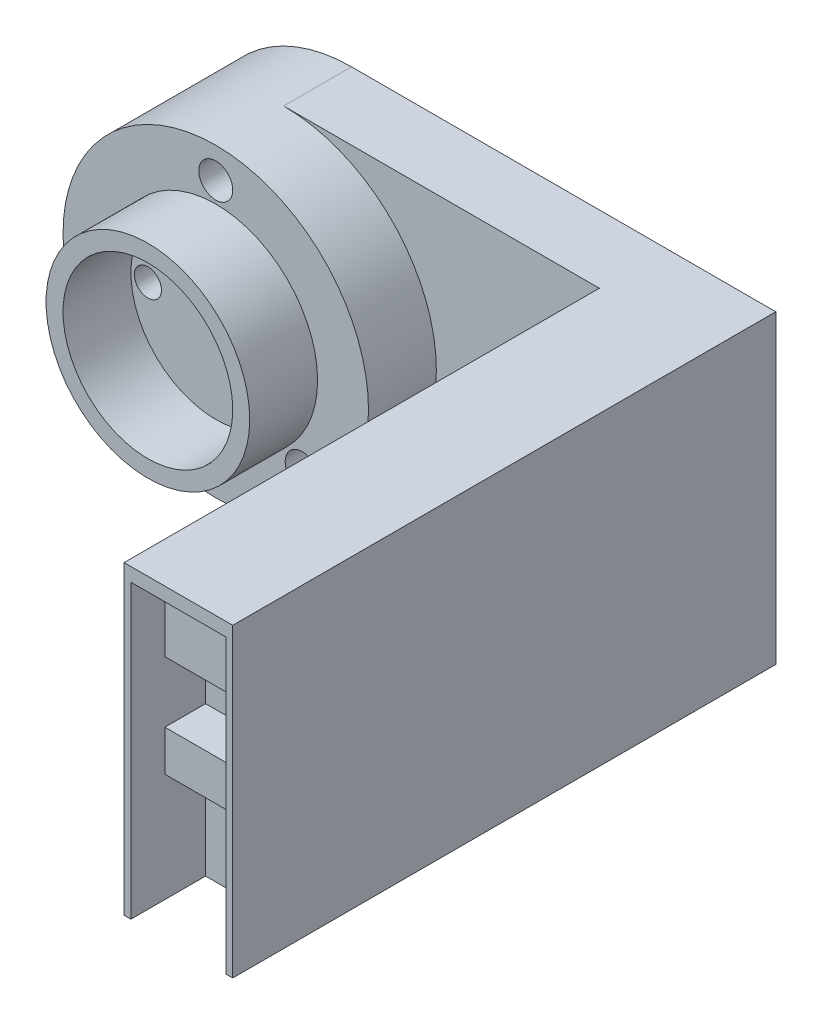
ISO-10303-21;
HEADER;
FILE_DESCRIPTION(('STEP AP214'),'2;1');
FILE_NAME('part.step','',(''),(''),'','','');
FILE_SCHEMA(('AUTOMOTIVE_DESIGN { 1 0 10303 214 1 1 1 1 }'));
ENDSEC;
DATA;
#1=APPLICATION_CONTEXT('core data for automotive mechanical design processes');
#2=APPLICATION_PROTOCOL_DEFINITION('international standard','automotive_design',2000,#1);
#3=PRODUCT_CONTEXT('',#1,'mechanical');
#4=PRODUCT('Part','Part','',(#3));
#5=PRODUCT_RELATED_PRODUCT_CATEGORY('part','',(#4));
#6=PRODUCT_DEFINITION_FORMATION('','',#4);
#7=PRODUCT_DEFINITION_CONTEXT('part definition',#1,'design');
#8=PRODUCT_DEFINITION('design','',#6,#7);
#9=PRODUCT_DEFINITION_SHAPE('','',#8);
#10=(LENGTH_UNIT() NAMED_UNIT(*) SI_UNIT(.MILLI.,.METRE.));
#11=(NAMED_UNIT(*) PLANE_ANGLE_UNIT() SI_UNIT($,.RADIAN.));
#12=(NAMED_UNIT(*) SI_UNIT($,.STERADIAN.) SOLID_ANGLE_UNIT());
#13=UNCERTAINTY_MEASURE_WITH_UNIT(LENGTH_MEASURE(1.E-05),#10,'distance_accuracy_value','');
#14=(GEOMETRIC_REPRESENTATION_CONTEXT(3) GLOBAL_UNCERTAINTY_ASSIGNED_CONTEXT((#13)) GLOBAL_UNIT_ASSIGNED_CONTEXT((#10,
#11,#12)) REPRESENTATION_CONTEXT('',''));
#15=CARTESIAN_POINT('',(0.,0.,0.));
#16=DIRECTION('',(0.,0.,1.));
#17=DIRECTION('',(1.,0.,0.));
#18=AXIS2_PLACEMENT_3D('',#15,#16,#17);
#19=CARTESIAN_POINT('',(0.,0.,10.));
#20=DIRECTION('',(0.,0.,1.));
#21=DIRECTION('',(1.,0.,0.));
#22=AXIS2_PLACEMENT_3D('',#19,#20,#21);
#23=PLANE('',#22);
#24=DIRECTION('',(1.,0.,0.));
#25=VECTOR('',#24,1.);
#26=CARTESIAN_POINT('',(0.,-22.5,10.));
#27=LINE('',#26,#25);
#28=CARTESIAN_POINT('',(0.,-22.5,10.));
#29=VERTEX_POINT('',#28);
#30=CARTESIAN_POINT('',(46.5,-22.5,10.));
#31=VERTEX_POINT('',#30);
#32=EDGE_CURVE('E432',#29,#31,#27,.T.);
#33=ORIENTED_EDGE('',*,*,#32,.T.);
#34=DIRECTION('',(0.,-1.,0.));
#35=VECTOR('',#34,1.);
#36=CARTESIAN_POINT('',(46.5,22.5,10.));
#37=LINE('',#36,#35);
#38=CARTESIAN_POINT('',(46.5,22.5,10.));
#39=VERTEX_POINT('',#38);
#40=EDGE_CURVE('E342',#39,#31,#37,.T.);
#41=ORIENTED_EDGE('',*,*,#40,.F.);
#42=DIRECTION('',(-1.,0.,0.));
#43=VECTOR('',#42,1.);
#44=CARTESIAN_POINT('',(0.,22.5,10.));
#45=LINE('',#44,#43);
#46=CARTESIAN_POINT('',(0.,22.5,10.));
#47=VERTEX_POINT('',#46);
#48=EDGE_CURVE('E435',#39,#47,#45,.T.);
#49=ORIENTED_EDGE('',*,*,#48,.T.);
#50=CARTESIAN_POINT('',(0.,0.,10.));
#51=DIRECTION('',(0.,0.,1.));
#52=DIRECTION('',(1.,0.,0.));
#53=AXIS2_PLACEMENT_3D('',#50,#51,#52);
#54=CIRCLE('',#53,22.5);
#55=EDGE_CURVE('E431',#29,#47,#54,.T.);
#56=ORIENTED_EDGE('',*,*,#55,.F.);
#57=EDGE_LOOP('',(#33,#41,#49,#56));
#58=FACE_BOUND('',#57,.T.);
#59=ADVANCED_FACE('F45',(#58),#23,.T.);
#60=CARTESIAN_POINT('',(0.,0.,20.));
#61=DIRECTION('',(0.,0.,-1.));
#62=DIRECTION('',(-1.,0.,0.));
#63=AXIS2_PLACEMENT_3D('',#60,#61,#62);
#64=CYLINDRICAL_SURFACE('',#63,22.5);
#65=CARTESIAN_POINT('',(0.,0.,0.));
#66=DIRECTION('',(0.,0.,1.));
#67=DIRECTION('',(1.,0.,0.));
#68=AXIS2_PLACEMENT_3D('',#65,#66,#67);
#69=CIRCLE('',#68,22.5);
#70=CARTESIAN_POINT('',(0.,22.5,0.));
#71=VERTEX_POINT('',#70);
#72=CARTESIAN_POINT('',(-22.1415898254845,4.,0.));
#73=VERTEX_POINT('',#72);
#74=EDGE_CURVE('E468',#71,#73,#69,.T.);
#75=ORIENTED_EDGE('',*,*,#74,.T.);
#76=DIRECTION('',(0.,0.,-1.));
#77=VECTOR('',#76,1.);
#78=CARTESIAN_POINT('',(-22.1415898254845,4.,20.));
#79=LINE('',#78,#77);
#80=CARTESIAN_POINT('',(-22.1415898254845,4.,10.));
#81=VERTEX_POINT('',#80);
#82=EDGE_CURVE('E247',#73,#81,#79,.F.);
#83=ORIENTED_EDGE('',*,*,#82,.T.);
#84=CARTESIAN_POINT('',(0.,0.,10.));
#85=DIRECTION('',(0.,0.,1.));
#86=DIRECTION('',(1.,0.,0.));
#87=AXIS2_PLACEMENT_3D('',#84,#85,#86);
#88=CIRCLE('',#87,22.5);
#89=CARTESIAN_POINT('',(-22.1415898254845,-4.,10.));
#90=VERTEX_POINT('',#89);
#91=EDGE_CURVE('E242',#81,#90,#88,.T.);
#92=ORIENTED_EDGE('',*,*,#91,.T.);
#93=DIRECTION('',(0.,0.,-1.));
#94=VECTOR('',#93,1.);
#95=CARTESIAN_POINT('',(-22.1415898254845,-4.,20.));
#96=LINE('',#95,#94);
#97=CARTESIAN_POINT('',(-22.1415898254845,-4.,0.));
#98=VERTEX_POINT('',#97);
#99=EDGE_CURVE('E221',#90,#98,#96,.T.);
#100=ORIENTED_EDGE('',*,*,#99,.T.);
#101=CARTESIAN_POINT('',(0.,-22.5,0.));
#102=VERTEX_POINT('',#101);
#103=EDGE_CURVE('E463',#98,#102,#69,.T.);
#104=ORIENTED_EDGE('',*,*,#103,.T.);
#105=DIRECTION('',(0.,0.,-1.));
#106=VECTOR('',#105,1.);
#107=CARTESIAN_POINT('',(0.,-22.5,10.));
#108=LINE('',#107,#106);
#109=EDGE_CURVE('E459',#29,#102,#108,.T.);
#110=ORIENTED_EDGE('',*,*,#109,.F.);
#111=ORIENTED_EDGE('',*,*,#55,.T.);
#112=DIRECTION('',(0.,0.,-1.));
#113=VECTOR('',#112,1.);
#114=CARTESIAN_POINT('',(0.,22.5,10.));
#115=LINE('',#114,#113);
#116=EDGE_CURVE('E439',#47,#71,#115,.T.);
#117=ORIENTED_EDGE('',*,*,#116,.T.);
#118=EDGE_LOOP('',(#75,#83,#92,#100,#104,#110,#111,#117));
#119=FACE_BOUND('',#118,.T.);
#120=CARTESIAN_POINT('',(0.,0.,20.));
#121=DIRECTION('',(0.,0.,1.));
#122=DIRECTION('',(1.,0.,0.));
#123=AXIS2_PLACEMENT_3D('',#120,#121,#122);
#124=CIRCLE('',#123,22.5);
#125=CARTESIAN_POINT('',(22.5,0.,20.));
#126=VERTEX_POINT('',#125);
#127=EDGE_CURVE('E464',#126,#126,#124,.T.);
#128=ORIENTED_EDGE('',*,*,#127,.F.);
#129=EDGE_LOOP('',(#128));
#130=FACE_BOUND('',#129,.T.);
#131=ADVANCED_FACE('F47',(#119,#130),#64,.T.);
#132=CARTESIAN_POINT('',(0.,0.,20.));
#133=DIRECTION('',(0.,0.,1.));
#134=DIRECTION('',(1.,0.,0.));
#135=AXIS2_PLACEMENT_3D('',#132,#133,#134);
#136=PLANE('',#135);
#137=CARTESIAN_POINT('',(0.,18.,20.));
#138=DIRECTION('',(0.,0.,1.));
#139=DIRECTION('',(1.,0.,0.));
#140=AXIS2_PLACEMENT_3D('',#137,#138,#139);
#141=CIRCLE('',#140,2.5);
#142=CARTESIAN_POINT('',(2.5,18.,20.));
#143=VERTEX_POINT('',#142);
#144=EDGE_CURVE('E384',#143,#143,#141,.T.);
#145=ORIENTED_EDGE('',*,*,#144,.F.);
#146=EDGE_LOOP('',(#145));
#147=FACE_BOUND('',#146,.T.);
#148=CARTESIAN_POINT('',(12.7279220613579,-12.7279220613579,20.));
#149=DIRECTION('',(0.,0.,1.));
#150=DIRECTION('',(1.,0.,0.));
#151=AXIS2_PLACEMENT_3D('',#148,#149,#150);
#152=CIRCLE('',#151,2.5);
#153=CARTESIAN_POINT('',(15.2279220613578,-12.7279220613579,20.));
#154=VERTEX_POINT('',#153);
#155=EDGE_CURVE('E388',#154,#154,#152,.T.);
#156=ORIENTED_EDGE('',*,*,#155,.F.);
#157=EDGE_LOOP('',(#156));
#158=FACE_BOUND('',#157,.T.);
#159=CARTESIAN_POINT('',(-12.7279220613579,-12.7279220613579,20.));
#160=DIRECTION('',(0.,0.,1.));
#161=DIRECTION('',(1.,0.,0.));
#162=AXIS2_PLACEMENT_3D('',#159,#160,#161);
#163=CIRCLE('',#162,2.5);
#164=CARTESIAN_POINT('',(-10.2279220613579,-12.7279220613579,20.));
#165=VERTEX_POINT('',#164);
#166=EDGE_CURVE('E396',#165,#165,#163,.T.);
#167=ORIENTED_EDGE('',*,*,#166,.F.);
#168=EDGE_LOOP('',(#167));
#169=FACE_BOUND('',#168,.T.);
#170=CARTESIAN_POINT('',(0.,0.,20.));
#171=DIRECTION('',(0.,0.,1.));
#172=DIRECTION('',(1.,0.,0.));
#173=AXIS2_PLACEMENT_3D('',#170,#171,#172);
#174=CIRCLE('',#173,15.);
#175=CARTESIAN_POINT('',(15.,0.,20.));
#176=VERTEX_POINT('',#175);
#177=EDGE_CURVE('E427',#176,#176,#174,.T.);
#178=ORIENTED_EDGE('',*,*,#177,.F.);
#179=EDGE_LOOP('',(#178));
#180=FACE_BOUND('',#179,.T.);
#181=ORIENTED_EDGE('',*,*,#127,.T.);
#182=EDGE_LOOP('',(#181));
#183=FACE_BOUND('',#182,.T.);
#184=ADVANCED_FACE('F578',(#147,#158,#169,#180,#183),#136,.T.);
#185=CARTESIAN_POINT('',(0.,0.,0.));
#186=DIRECTION('',(0.,0.,1.));
#187=DIRECTION('',(1.,0.,0.));
#188=AXIS2_PLACEMENT_3D('',#185,#186,#187);
#189=PLANE('',#188);
#190=CARTESIAN_POINT('',(10.,0.,0.));
#191=DIRECTION('',(0.,0.,1.));
#192=DIRECTION('',(-1.,0.,0.));
#193=AXIS2_PLACEMENT_3D('',#190,#191,#192);
#194=CIRCLE('',#193,2.);
#195=CARTESIAN_POINT('',(10.,-2.,0.));
#196=VERTEX_POINT('',#195);
#197=CARTESIAN_POINT('',(10.,2.,0.));
#198=VERTEX_POINT('',#197);
#199=EDGE_CURVE('E383',#196,#198,#194,.T.);
#200=ORIENTED_EDGE('',*,*,#199,.T.);
#201=DIRECTION('',(0.,-1.,0.));
#202=VECTOR('',#201,1.);
#203=CARTESIAN_POINT('',(10.,2.,0.));
#204=LINE('',#203,#202);
#205=CARTESIAN_POINT('',(10.,4.,0.));
#206=VERTEX_POINT('',#205);
#207=EDGE_CURVE('E206',#206,#198,#204,.T.);
#208=ORIENTED_EDGE('',*,*,#207,.F.);
#209=DIRECTION('',(1.,0.,0.));
#210=VECTOR('',#209,1.);
#211=CARTESIAN_POINT('',(10.,4.,0.));
#212=LINE('',#211,#210);
#213=EDGE_CURVE('E231',#73,#206,#212,.T.);
#214=ORIENTED_EDGE('',*,*,#213,.F.);
#215=ORIENTED_EDGE('',*,*,#74,.F.);
#216=DIRECTION('',(-1.,0.,0.));
#217=VECTOR('',#216,1.);
#218=CARTESIAN_POINT('',(0.,22.5,0.));
#219=LINE('',#218,#217);
#220=CARTESIAN_POINT('',(62.5,22.5,0.));
#221=VERTEX_POINT('',#220);
#222=EDGE_CURVE('E436',#221,#71,#219,.T.);
#223=ORIENTED_EDGE('',*,*,#222,.F.);
#224=DIRECTION('',(0.,1.,0.));
#225=VECTOR('',#224,1.);
#226=CARTESIAN_POINT('',(62.5,22.5,0.));
#227=LINE('',#226,#225);
#228=CARTESIAN_POINT('',(62.5,-22.5,0.));
#229=VERTEX_POINT('',#228);
#230=EDGE_CURVE('E442',#229,#221,#227,.T.);
#231=ORIENTED_EDGE('',*,*,#230,.F.);
#232=DIRECTION('',(1.,0.,0.));
#233=VECTOR('',#232,1.);
#234=CARTESIAN_POINT('',(0.,-22.5,0.));
#235=LINE('',#234,#233);
#236=EDGE_CURVE('E426',#102,#229,#235,.T.);
#237=ORIENTED_EDGE('',*,*,#236,.F.);
#238=ORIENTED_EDGE('',*,*,#103,.F.);
#239=DIRECTION('',(-1.,0.,0.));
#240=VECTOR('',#239,1.);
#241=CARTESIAN_POINT('',(-24.,-4.,0.));
#242=LINE('',#241,#240);
#243=CARTESIAN_POINT('',(10.,-4.,0.));
#244=VERTEX_POINT('',#243);
#245=EDGE_CURVE('E228',#244,#98,#242,.T.);
#246=ORIENTED_EDGE('',*,*,#245,.F.);
#247=EDGE_CURVE('E212',#196,#244,#204,.T.);
#248=ORIENTED_EDGE('',*,*,#247,.F.);
#249=EDGE_LOOP('',(#200,#208,#214,#215,#223,#231,#237,#238,#246,#248));
#250=FACE_BOUND('',#249,.T.);
#251=ADVANCED_FACE('F483',(#250),#189,.F.);
#252=CARTESIAN_POINT('',(0.,-22.5,10.));
#253=DIRECTION('',(0.,1.,0.));
#254=DIRECTION('',(0.,0.,1.));
#255=AXIS2_PLACEMENT_3D('',#252,#253,#254);
#256=PLANE('',#255);
#257=DIRECTION('',(1.,0.,0.));
#258=VECTOR('',#257,1.);
#259=CARTESIAN_POINT('',(47.5,-22.5,69.));
#260=LINE('',#259,#258);
#261=CARTESIAN_POINT('',(47.5,-22.5,69.));
#262=VERTEX_POINT('',#261);
#263=CARTESIAN_POINT('',(61.5,-22.5,69.));
#264=VERTEX_POINT('',#263);
#265=EDGE_CURVE('E309',#262,#264,#260,.T.);
#266=ORIENTED_EDGE('',*,*,#265,.F.);
#267=DIRECTION('',(0.,0.,1.));
#268=VECTOR('',#267,1.);
#269=CARTESIAN_POINT('',(47.5,-22.5,75.));
#270=LINE('',#269,#268);
#271=CARTESIAN_POINT('',(47.5,-22.5,80.));
#272=VERTEX_POINT('',#271);
#273=EDGE_CURVE('E328',#262,#272,#270,.T.);
#274=ORIENTED_EDGE('',*,*,#273,.T.);
#275=DIRECTION('',(1.,0.,0.));
#276=VECTOR('',#275,1.);
#277=CARTESIAN_POINT('',(62.5,-22.5,80.));
#278=LINE('',#277,#276);
#279=CARTESIAN_POINT('',(46.5,-22.5,80.));
#280=VERTEX_POINT('',#279);
#281=EDGE_CURVE('E363',#280,#272,#278,.T.);
#282=ORIENTED_EDGE('',*,*,#281,.F.);
#283=DIRECTION('',(0.,0.,-1.));
#284=VECTOR('',#283,1.);
#285=CARTESIAN_POINT('',(46.5,-22.5,80.));
#286=LINE('',#285,#284);
#287=EDGE_CURVE('E367',#280,#31,#286,.T.);
#288=ORIENTED_EDGE('',*,*,#287,.T.);
#289=ORIENTED_EDGE('',*,*,#32,.F.);
#290=ORIENTED_EDGE('',*,*,#109,.T.);
#291=ORIENTED_EDGE('',*,*,#236,.T.);
#292=DIRECTION('',(0.,0.,-1.));
#293=VECTOR('',#292,1.);
#294=CARTESIAN_POINT('',(62.5,-22.5,10.));
#295=LINE('',#294,#293);
#296=CARTESIAN_POINT('',(62.5,-22.5,80.));
#297=VERTEX_POINT('',#296);
#298=EDGE_CURVE('E455',#297,#229,#295,.T.);
#299=ORIENTED_EDGE('',*,*,#298,.F.);
#300=CARTESIAN_POINT('',(61.5,-22.5,80.));
#301=VERTEX_POINT('',#300);
#302=EDGE_CURVE('E362',#301,#297,#278,.T.);
#303=ORIENTED_EDGE('',*,*,#302,.F.);
#304=DIRECTION('',(0.,0.,1.));
#305=VECTOR('',#304,1.);
#306=CARTESIAN_POINT('',(61.5,-22.5,75.));
#307=LINE('',#306,#305);
#308=EDGE_CURVE('E346',#264,#301,#307,.T.);
#309=ORIENTED_EDGE('',*,*,#308,.F.);
#310=EDGE_LOOP('',(#266,#274,#282,#288,#289,#290,#291,#299,#303,#309));
#311=FACE_BOUND('',#310,.T.);
#312=ADVANCED_FACE('F512',(#311),#256,.F.);
#313=CARTESIAN_POINT('',(62.5,22.5,10.));
#314=DIRECTION('',(-1.,0.,0.));
#315=DIRECTION('',(0.,0.,1.));
#316=AXIS2_PLACEMENT_3D('',#313,#314,#315);
#317=PLANE('',#316);
#318=ORIENTED_EDGE('',*,*,#230,.T.);
#319=DIRECTION('',(0.,0.,-1.));
#320=VECTOR('',#319,1.);
#321=CARTESIAN_POINT('',(62.5,22.5,10.));
#322=LINE('',#321,#320);
#323=CARTESIAN_POINT('',(62.5,22.5,80.));
#324=VERTEX_POINT('',#323);
#325=EDGE_CURVE('E451',#324,#221,#322,.T.);
#326=ORIENTED_EDGE('',*,*,#325,.F.);
#327=DIRECTION('',(0.,1.,0.));
#328=VECTOR('',#327,1.);
#329=CARTESIAN_POINT('',(62.5,22.5,80.));
#330=LINE('',#329,#328);
#331=EDGE_CURVE('E352',#297,#324,#330,.T.);
#332=ORIENTED_EDGE('',*,*,#331,.F.);
#333=ORIENTED_EDGE('',*,*,#298,.T.);
#334=EDGE_LOOP('',(#318,#326,#332,#333));
#335=FACE_BOUND('',#334,.T.);
#336=ADVANCED_FACE('F506',(#335),#317,.F.);
#337=CARTESIAN_POINT('',(0.,22.5,10.));
#338=DIRECTION('',(0.,-1.,0.));
#339=DIRECTION('',(0.,0.,-1.));
#340=AXIS2_PLACEMENT_3D('',#337,#338,#339);
#341=PLANE('',#340);
#342=ORIENTED_EDGE('',*,*,#222,.T.);
#343=ORIENTED_EDGE('',*,*,#116,.F.);
#344=ORIENTED_EDGE('',*,*,#48,.F.);
#345=DIRECTION('',(0.,0.,-1.));
#346=VECTOR('',#345,1.);
#347=CARTESIAN_POINT('',(46.5,22.5,80.));
#348=LINE('',#347,#346);
#349=CARTESIAN_POINT('',(46.5,22.5,80.));
#350=VERTEX_POINT('',#349);
#351=EDGE_CURVE('E374',#350,#39,#348,.T.);
#352=ORIENTED_EDGE('',*,*,#351,.F.);
#353=DIRECTION('',(-1.,0.,0.));
#354=VECTOR('',#353,1.);
#355=CARTESIAN_POINT('',(62.5,22.5,80.));
#356=LINE('',#355,#354);
#357=EDGE_CURVE('E356',#324,#350,#356,.T.);
#358=ORIENTED_EDGE('',*,*,#357,.F.);
#359=ORIENTED_EDGE('',*,*,#325,.T.);
#360=EDGE_LOOP('',(#342,#343,#344,#352,#358,#359));
#361=FACE_BOUND('',#360,.T.);
#362=ADVANCED_FACE('F502',(#361),#341,.F.);
#363=CARTESIAN_POINT('',(0.,0.,30.));
#364=DIRECTION('',(0.,0.,-1.));
#365=DIRECTION('',(-1.,0.,0.));
#366=AXIS2_PLACEMENT_3D('',#363,#364,#365);
#367=CYLINDRICAL_SURFACE('',#366,15.);
#368=CARTESIAN_POINT('',(0.,0.,30.));
#369=DIRECTION('',(0.,0.,1.));
#370=DIRECTION('',(1.,0.,0.));
#371=AXIS2_PLACEMENT_3D('',#368,#369,#370);
#372=CIRCLE('',#371,15.);
#373=CARTESIAN_POINT('',(15.,0.,30.));
#374=VERTEX_POINT('',#373);
#375=EDGE_CURVE('E419',#374,#374,#372,.T.);
#376=ORIENTED_EDGE('',*,*,#375,.F.);
#377=EDGE_LOOP('',(#376));
#378=FACE_BOUND('',#377,.T.);
#379=ORIENTED_EDGE('',*,*,#177,.T.);
#380=EDGE_LOOP('',(#379));
#381=FACE_BOUND('',#380,.T.);
#382=ADVANCED_FACE('F581',(#378,#381),#367,.T.);
#383=CARTESIAN_POINT('',(0.,0.,30.));
#384=DIRECTION('',(0.,0.,1.));
#385=DIRECTION('',(1.,0.,0.));
#386=AXIS2_PLACEMENT_3D('',#383,#384,#385);
#387=PLANE('',#386);
#388=CARTESIAN_POINT('',(0.,0.,30.));
#389=DIRECTION('',(0.,0.,1.));
#390=DIRECTION('',(1.,0.,0.));
#391=AXIS2_PLACEMENT_3D('',#388,#389,#390);
#392=CIRCLE('',#391,12.5);
#393=CARTESIAN_POINT('',(12.5,0.,30.));
#394=VERTEX_POINT('',#393);
#395=EDGE_CURVE('E407',#394,#394,#392,.T.);
#396=ORIENTED_EDGE('',*,*,#395,.F.);
#397=EDGE_LOOP('',(#396));
#398=FACE_BOUND('',#397,.T.);
#399=ORIENTED_EDGE('',*,*,#375,.T.);
#400=EDGE_LOOP('',(#399));
#401=FACE_BOUND('',#400,.T.);
#402=ADVANCED_FACE('F818',(#398,#401),#387,.T.);
#403=CARTESIAN_POINT('',(0.,0.,20.));
#404=DIRECTION('',(0.,0.,1.));
#405=DIRECTION('',(1.,0.,0.));
#406=AXIS2_PLACEMENT_3D('',#403,#404,#405);
#407=CYLINDRICAL_SURFACE('',#406,12.5);
#408=CARTESIAN_POINT('',(0.,0.,20.));
#409=DIRECTION('',(0.,0.,1.));
#410=DIRECTION('',(1.,0.,0.));
#411=AXIS2_PLACEMENT_3D('',#408,#409,#410);
#412=CIRCLE('',#411,12.5);
#413=CARTESIAN_POINT('',(12.5,0.,20.));
#414=VERTEX_POINT('',#413);
#415=EDGE_CURVE('E415',#414,#414,#412,.T.);
#416=ORIENTED_EDGE('',*,*,#415,.F.);
#417=EDGE_LOOP('',(#416));
#418=FACE_BOUND('',#417,.T.);
#419=ORIENTED_EDGE('',*,*,#395,.T.);
#420=EDGE_LOOP('',(#419));
#421=FACE_BOUND('',#420,.T.);
#422=ADVANCED_FACE('F809',(#418,#421),#407,.F.);
#423=CARTESIAN_POINT('',(0.,0.,20.));
#424=DIRECTION('',(0.,0.,1.));
#425=DIRECTION('',(1.,0.,0.));
#426=AXIS2_PLACEMENT_3D('',#423,#424,#425);
#427=PLANE('',#426);
#428=CARTESIAN_POINT('',(-10.,0.,20.));
#429=DIRECTION('',(0.,0.,1.));
#430=DIRECTION('',(1.,0.,0.));
#431=AXIS2_PLACEMENT_3D('',#428,#429,#430);
#432=CIRCLE('',#431,2.);
#433=CARTESIAN_POINT('',(-8.,0.,20.));
#434=VERTEX_POINT('',#433);
#435=EDGE_CURVE('E403',#434,#434,#432,.T.);
#436=ORIENTED_EDGE('',*,*,#435,.F.);
#437=EDGE_LOOP('',(#436));
#438=FACE_BOUND('',#437,.T.);
#439=CARTESIAN_POINT('',(10.,0.,20.));
#440=DIRECTION('',(0.,0.,1.));
#441=DIRECTION('',(-1.,0.,0.));
#442=AXIS2_PLACEMENT_3D('',#439,#440,#441);
#443=CIRCLE('',#442,2.);
#444=CARTESIAN_POINT('',(8.,0.,20.));
#445=VERTEX_POINT('',#444);
#446=EDGE_CURVE('E408',#445,#445,#443,.T.);
#447=ORIENTED_EDGE('',*,*,#446,.F.);
#448=EDGE_LOOP('',(#447));
#449=FACE_BOUND('',#448,.T.);
#450=ORIENTED_EDGE('',*,*,#415,.T.);
#451=EDGE_LOOP('',(#450));
#452=FACE_BOUND('',#451,.T.);
#453=ADVANCED_FACE('F605',(#438,#449,#452),#427,.T.);
#454=CARTESIAN_POINT('',(10.,0.,0.));
#455=DIRECTION('',(0.,0.,1.));
#456=DIRECTION('',(1.,0.,0.));
#457=AXIS2_PLACEMENT_3D('',#454,#455,#456);
#458=CYLINDRICAL_SURFACE('',#457,2.);
#459=CARTESIAN_POINT('',(10.,0.,10.));
#460=DIRECTION('',(0.,0.,1.));
#461=DIRECTION('',(1.,0.,0.));
#462=AXIS2_PLACEMENT_3D('',#459,#460,#461);
#463=CIRCLE('',#462,2.);
#464=CARTESIAN_POINT('',(10.,-2.,10.));
#465=VERTEX_POINT('',#464);
#466=CARTESIAN_POINT('',(10.,2.,10.));
#467=VERTEX_POINT('',#466);
#468=EDGE_CURVE('E202',#465,#467,#463,.F.);
#469=ORIENTED_EDGE('',*,*,#468,.T.);
#470=DIRECTION('',(0.,0.,1.));
#471=VECTOR('',#470,1.);
#472=CARTESIAN_POINT('',(10.,2.,0.));
#473=LINE('',#472,#471);
#474=EDGE_CURVE('E11',#467,#198,#473,.F.);
#475=ORIENTED_EDGE('',*,*,#474,.T.);
#476=ORIENTED_EDGE('',*,*,#199,.F.);
#477=DIRECTION('',(0.,0.,1.));
#478=VECTOR('',#477,1.);
#479=CARTESIAN_POINT('',(10.,-2.,0.));
#480=LINE('',#479,#478);
#481=EDGE_CURVE('E54',#196,#465,#480,.T.);
#482=ORIENTED_EDGE('',*,*,#481,.T.);
#483=EDGE_LOOP('',(#469,#475,#476,#482));
#484=FACE_BOUND('',#483,.T.);
#485=ORIENTED_EDGE('',*,*,#446,.T.);
#486=EDGE_LOOP('',(#485));
#487=FACE_BOUND('',#486,.T.);
#488=ADVANCED_FACE('F480',(#484,#487),#458,.F.);
#489=CARTESIAN_POINT('',(-10.,0.,0.));
#490=DIRECTION('',(0.,0.,1.));
#491=DIRECTION('',(1.,0.,0.));
#492=AXIS2_PLACEMENT_3D('',#489,#490,#491);
#493=CYLINDRICAL_SURFACE('',#492,2.);
#494=CARTESIAN_POINT('',(-10.,0.,10.));
#495=DIRECTION('',(0.,0.,1.));
#496=DIRECTION('',(1.,0.,0.));
#497=AXIS2_PLACEMENT_3D('',#494,#495,#496);
#498=CIRCLE('',#497,2.);
#499=CARTESIAN_POINT('',(-8.,0.,10.));
#500=VERTEX_POINT('',#499);
#501=EDGE_CURVE('E238',#500,#500,#498,.F.);
#502=ORIENTED_EDGE('',*,*,#501,.T.);
#503=EDGE_LOOP('',(#502));
#504=FACE_BOUND('',#503,.T.);
#505=ORIENTED_EDGE('',*,*,#435,.T.);
#506=EDGE_LOOP('',(#505));
#507=FACE_BOUND('',#506,.T.);
#508=ADVANCED_FACE('F604',(#504,#507),#493,.F.);
#509=CARTESIAN_POINT('',(-12.7279220613579,-12.7279220613579,10.));
#510=DIRECTION('',(0.,0.,1.));
#511=DIRECTION('',(1.,0.,0.));
#512=AXIS2_PLACEMENT_3D('',#509,#510,#511);
#513=CYLINDRICAL_SURFACE('',#512,2.5);
#514=CARTESIAN_POINT('',(-12.7279220613579,-12.7279220613579,10.));
#515=DIRECTION('',(0.,0.,1.));
#516=DIRECTION('',(1.,0.,0.));
#517=AXIS2_PLACEMENT_3D('',#514,#515,#516);
#518=CIRCLE('',#517,2.5);
#519=CARTESIAN_POINT('',(-10.2279220613579,-12.7279220613579,10.));
#520=VERTEX_POINT('',#519);
#521=EDGE_CURVE('E378',#520,#520,#518,.T.);
#522=ORIENTED_EDGE('',*,*,#521,.F.);
#523=EDGE_LOOP('',(#522));
#524=FACE_BOUND('',#523,.T.);
#525=ORIENTED_EDGE('',*,*,#166,.T.);
#526=EDGE_LOOP('',(#525));
#527=FACE_BOUND('',#526,.T.);
#528=ADVANCED_FACE('F614',(#524,#527),#513,.F.);
#529=CARTESIAN_POINT('',(-12.7279220613579,-12.7279220613579,10.));
#530=DIRECTION('',(0.,0.,1.));
#531=DIRECTION('',(1.,0.,0.));
#532=AXIS2_PLACEMENT_3D('',#529,#530,#531);
#533=PLANE('',#532);
#534=ORIENTED_EDGE('',*,*,#521,.T.);
#535=EDGE_LOOP('',(#534));
#536=FACE_BOUND('',#535,.T.);
#537=ADVANCED_FACE('F784',(#536),#533,.T.);
#538=CARTESIAN_POINT('',(12.7279220613579,-12.7279220613579,10.));
#539=DIRECTION('',(0.,0.,1.));
#540=DIRECTION('',(1.,0.,0.));
#541=AXIS2_PLACEMENT_3D('',#538,#539,#540);
#542=CYLINDRICAL_SURFACE('',#541,2.5);
#543=CARTESIAN_POINT('',(12.7279220613579,-12.7279220613579,10.));
#544=DIRECTION('',(0.,0.,1.));
#545=DIRECTION('',(1.,0.,0.));
#546=AXIS2_PLACEMENT_3D('',#543,#544,#545);
#547=CIRCLE('',#546,2.5);
#548=CARTESIAN_POINT('',(15.2279220613578,-12.7279220613579,10.));
#549=VERTEX_POINT('',#548);
#550=EDGE_CURVE('E392',#549,#549,#547,.T.);
#551=ORIENTED_EDGE('',*,*,#550,.F.);
#552=EDGE_LOOP('',(#551));
#553=FACE_BOUND('',#552,.T.);
#554=ORIENTED_EDGE('',*,*,#155,.T.);
#555=EDGE_LOOP('',(#554));
#556=FACE_BOUND('',#555,.T.);
#557=ADVANCED_FACE('F775',(#553,#556),#542,.F.);
#558=CARTESIAN_POINT('',(12.7279220613579,-12.7279220613579,10.));
#559=DIRECTION('',(0.,0.,1.));
#560=DIRECTION('',(1.,0.,0.));
#561=AXIS2_PLACEMENT_3D('',#558,#559,#560);
#562=PLANE('',#561);
#563=ORIENTED_EDGE('',*,*,#550,.T.);
#564=EDGE_LOOP('',(#563));
#565=FACE_BOUND('',#564,.T.);
#566=ADVANCED_FACE('F766',(#565),#562,.T.);
#567=CARTESIAN_POINT('',(0.,18.,10.));
#568=DIRECTION('',(0.,0.,1.));
#569=DIRECTION('',(1.,0.,0.));
#570=AXIS2_PLACEMENT_3D('',#567,#568,#569);
#571=CYLINDRICAL_SURFACE('',#570,2.5);
#572=CARTESIAN_POINT('',(0.,18.,10.));
#573=DIRECTION('',(0.,0.,1.));
#574=DIRECTION('',(1.,0.,0.));
#575=AXIS2_PLACEMENT_3D('',#572,#573,#574);
#576=CIRCLE('',#575,2.5);
#577=CARTESIAN_POINT('',(2.5,18.,10.));
#578=VERTEX_POINT('',#577);
#579=EDGE_CURVE('E379',#578,#578,#576,.T.);
#580=ORIENTED_EDGE('',*,*,#579,.F.);
#581=EDGE_LOOP('',(#580));
#582=FACE_BOUND('',#581,.T.);
#583=ORIENTED_EDGE('',*,*,#144,.T.);
#584=EDGE_LOOP('',(#583));
#585=FACE_BOUND('',#584,.T.);
#586=ADVANCED_FACE('F757',(#582,#585),#571,.F.);
#587=CARTESIAN_POINT('',(0.,18.,10.));
#588=DIRECTION('',(0.,0.,1.));
#589=DIRECTION('',(1.,0.,0.));
#590=AXIS2_PLACEMENT_3D('',#587,#588,#589);
#591=PLANE('',#590);
#592=ORIENTED_EDGE('',*,*,#579,.T.);
#593=EDGE_LOOP('',(#592));
#594=FACE_BOUND('',#593,.T.);
#595=ADVANCED_FACE('F743',(#594),#591,.T.);
#596=CARTESIAN_POINT('',(46.5,22.5,80.));
#597=DIRECTION('',(1.,0.,0.));
#598=DIRECTION('',(0.,1.,0.));
#599=AXIS2_PLACEMENT_3D('',#596,#597,#598);
#600=PLANE('',#599);
#601=ORIENTED_EDGE('',*,*,#40,.T.);
#602=ORIENTED_EDGE('',*,*,#287,.F.);
#603=DIRECTION('',(0.,-1.,0.));
#604=VECTOR('',#603,1.);
#605=CARTESIAN_POINT('',(46.5,22.5,80.));
#606=LINE('',#605,#604);
#607=EDGE_CURVE('E359',#350,#280,#606,.T.);
#608=ORIENTED_EDGE('',*,*,#607,.F.);
#609=ORIENTED_EDGE('',*,*,#351,.T.);
#610=EDGE_LOOP('',(#601,#602,#608,#609));
#611=FACE_BOUND('',#610,.T.);
#612=ADVANCED_FACE('F518',(#611),#600,.F.);
#613=CARTESIAN_POINT('',(0.,0.,80.));
#614=DIRECTION('',(0.,0.,-1.));
#615=DIRECTION('',(-1.,0.,0.));
#616=AXIS2_PLACEMENT_3D('',#613,#614,#615);
#617=PLANE('',#616);
#618=ORIENTED_EDGE('',*,*,#281,.T.);
#619=DIRECTION('',(0.,-1.,0.));
#620=VECTOR('',#619,1.);
#621=CARTESIAN_POINT('',(47.5,20.5,80.));
#622=LINE('',#621,#620);
#623=CARTESIAN_POINT('',(47.5,20.5,80.));
#624=VERTEX_POINT('',#623);
#625=EDGE_CURVE('E283',#624,#272,#622,.T.);
#626=ORIENTED_EDGE('',*,*,#625,.F.);
#627=DIRECTION('',(-1.,0.,0.));
#628=VECTOR('',#627,1.);
#629=CARTESIAN_POINT('',(47.5,20.5,80.));
#630=LINE('',#629,#628);
#631=CARTESIAN_POINT('',(61.5,20.5,80.));
#632=VERTEX_POINT('',#631);
#633=EDGE_CURVE('E335',#632,#624,#630,.T.);
#634=ORIENTED_EDGE('',*,*,#633,.F.);
#635=DIRECTION('',(0.,1.,0.));
#636=VECTOR('',#635,1.);
#637=CARTESIAN_POINT('',(61.5,20.5,80.));
#638=LINE('',#637,#636);
#639=EDGE_CURVE('E331',#301,#632,#638,.T.);
#640=ORIENTED_EDGE('',*,*,#639,.F.);
#641=ORIENTED_EDGE('',*,*,#302,.T.);
#642=ORIENTED_EDGE('',*,*,#331,.T.);
#643=ORIENTED_EDGE('',*,*,#357,.T.);
#644=ORIENTED_EDGE('',*,*,#607,.T.);
#645=EDGE_LOOP('',(#618,#626,#634,#640,#641,#642,#643,#644));
#646=FACE_BOUND('',#645,.T.);
#647=ADVANCED_FACE('F522',(#646),#617,.F.);
#648=CARTESIAN_POINT('',(47.5,20.5,75.));
#649=DIRECTION('',(-1.,0.,0.));
#650=DIRECTION('',(0.,-1.,0.));
#651=AXIS2_PLACEMENT_3D('',#648,#649,#650);
#652=PLANE('',#651);
#653=ORIENTED_EDGE('',*,*,#625,.T.);
#654=ORIENTED_EDGE('',*,*,#273,.F.);
#655=DIRECTION('',(0.,-1.,0.));
#656=VECTOR('',#655,1.);
#657=CARTESIAN_POINT('',(47.5,-6.5,69.));
#658=LINE('',#657,#656);
#659=CARTESIAN_POINT('',(47.5,-6.5,69.));
#660=VERTEX_POINT('',#659);
#661=EDGE_CURVE('E301',#660,#262,#658,.T.);
#662=ORIENTED_EDGE('',*,*,#661,.F.);
#663=DIRECTION('',(0.,0.,1.));
#664=VECTOR('',#663,1.);
#665=CARTESIAN_POINT('',(47.5,-6.5,69.));
#666=LINE('',#665,#664);
#667=CARTESIAN_POINT('',(47.5,-6.5,75.));
#668=VERTEX_POINT('',#667);
#669=EDGE_CURVE('E251',#660,#668,#666,.T.);
#670=ORIENTED_EDGE('',*,*,#669,.T.);
#671=DIRECTION('',(0.,-1.,0.));
#672=VECTOR('',#671,1.);
#673=CARTESIAN_POINT('',(47.5,20.5,75.));
#674=LINE('',#673,#672);
#675=CARTESIAN_POINT('',(47.5,-0.5,75.));
#676=VERTEX_POINT('',#675);
#677=EDGE_CURVE('E321',#676,#668,#674,.T.);
#678=ORIENTED_EDGE('',*,*,#677,.F.);
#679=DIRECTION('',(0.,0.,1.));
#680=VECTOR('',#679,1.);
#681=CARTESIAN_POINT('',(47.5,-0.500000000000002,69.));
#682=LINE('',#681,#680);
#683=CARTESIAN_POINT('',(47.5,-0.500000000000002,69.));
#684=VERTEX_POINT('',#683);
#685=EDGE_CURVE('E69',#684,#676,#682,.T.);
#686=ORIENTED_EDGE('',*,*,#685,.F.);
#687=DIRECTION('',(0.,-1.,0.));
#688=VECTOR('',#687,1.);
#689=CARTESIAN_POINT('',(47.5,8.5,69.));
#690=LINE('',#689,#688);
#691=CARTESIAN_POINT('',(47.5,8.5,69.));
#692=VERTEX_POINT('',#691);
#693=EDGE_CURVE('E252',#692,#684,#690,.T.);
#694=ORIENTED_EDGE('',*,*,#693,.F.);
#695=DIRECTION('',(0.,0.,1.));
#696=VECTOR('',#695,1.);
#697=CARTESIAN_POINT('',(47.5,8.5,69.));
#698=LINE('',#697,#696);
#699=CARTESIAN_POINT('',(47.5,8.5,75.));
#700=VERTEX_POINT('',#699);
#701=EDGE_CURVE('E280',#692,#700,#698,.T.);
#702=ORIENTED_EDGE('',*,*,#701,.T.);
#703=CARTESIAN_POINT('',(47.5,20.5,75.));
#704=VERTEX_POINT('',#703);
#705=EDGE_CURVE('E316',#704,#700,#674,.T.);
#706=ORIENTED_EDGE('',*,*,#705,.F.);
#707=DIRECTION('',(0.,0.,1.));
#708=VECTOR('',#707,1.);
#709=CARTESIAN_POINT('',(47.5,20.5,75.));
#710=LINE('',#709,#708);
#711=EDGE_CURVE('E339',#704,#624,#710,.T.);
#712=ORIENTED_EDGE('',*,*,#711,.T.);
#713=EDGE_LOOP('',(#653,#654,#662,#670,#678,#686,#694,#702,#706,#712));
#714=FACE_BOUND('',#713,.T.);
#715=ADVANCED_FACE('F537',(#714),#652,.F.);
#716=CARTESIAN_POINT('',(47.5,20.5,75.));
#717=DIRECTION('',(0.,1.,0.));
#718=DIRECTION('',(0.,0.,1.));
#719=AXIS2_PLACEMENT_3D('',#716,#717,#718);
#720=PLANE('',#719);
#721=ORIENTED_EDGE('',*,*,#633,.T.);
#722=ORIENTED_EDGE('',*,*,#711,.F.);
#723=DIRECTION('',(-1.,0.,0.));
#724=VECTOR('',#723,1.);
#725=CARTESIAN_POINT('',(47.5,20.5,75.));
#726=LINE('',#725,#724);
#727=CARTESIAN_POINT('',(61.5,20.5,75.));
#728=VERTEX_POINT('',#727);
#729=EDGE_CURVE('E324',#728,#704,#726,.T.);
#730=ORIENTED_EDGE('',*,*,#729,.F.);
#731=DIRECTION('',(0.,0.,1.));
#732=VECTOR('',#731,1.);
#733=CARTESIAN_POINT('',(61.5,20.5,75.));
#734=LINE('',#733,#732);
#735=EDGE_CURVE('E343',#728,#632,#734,.T.);
#736=ORIENTED_EDGE('',*,*,#735,.T.);
#737=EDGE_LOOP('',(#721,#722,#730,#736));
#738=FACE_BOUND('',#737,.T.);
#739=ADVANCED_FACE('F551',(#738),#720,.F.);
#740=CARTESIAN_POINT('',(61.5,20.5,75.));
#741=DIRECTION('',(1.,0.,0.));
#742=DIRECTION('',(0.,1.,0.));
#743=AXIS2_PLACEMENT_3D('',#740,#741,#742);
#744=PLANE('',#743);
#745=ORIENTED_EDGE('',*,*,#639,.T.);
#746=ORIENTED_EDGE('',*,*,#735,.F.);
#747=DIRECTION('',(0.,1.,0.));
#748=VECTOR('',#747,1.);
#749=CARTESIAN_POINT('',(61.5,20.5,75.));
#750=LINE('',#749,#748);
#751=CARTESIAN_POINT('',(61.5,-6.5,75.));
#752=VERTEX_POINT('',#751);
#753=EDGE_CURVE('E320',#752,#728,#750,.T.);
#754=ORIENTED_EDGE('',*,*,#753,.F.);
#755=DIRECTION('',(0.,0.,1.));
#756=VECTOR('',#755,1.);
#757=CARTESIAN_POINT('',(61.5,-6.5,69.));
#758=LINE('',#757,#756);
#759=CARTESIAN_POINT('',(61.5,-6.5,69.));
#760=VERTEX_POINT('',#759);
#761=EDGE_CURVE('E292',#760,#752,#758,.T.);
#762=ORIENTED_EDGE('',*,*,#761,.F.);
#763=DIRECTION('',(0.,1.,0.));
#764=VECTOR('',#763,1.);
#765=CARTESIAN_POINT('',(61.5,-6.5,69.));
#766=LINE('',#765,#764);
#767=EDGE_CURVE('E305',#264,#760,#766,.T.);
#768=ORIENTED_EDGE('',*,*,#767,.F.);
#769=ORIENTED_EDGE('',*,*,#308,.T.);
#770=EDGE_LOOP('',(#745,#746,#754,#762,#768,#769));
#771=FACE_BOUND('',#770,.T.);
#772=ADVANCED_FACE('F545',(#771),#744,.F.);
#773=CARTESIAN_POINT('',(0.,0.,75.));
#774=DIRECTION('',(0.,0.,1.));
#775=DIRECTION('',(1.,0.,0.));
#776=AXIS2_PLACEMENT_3D('',#773,#774,#775);
#777=PLANE('',#776);
#778=DIRECTION('',(-1.,0.,0.));
#779=VECTOR('',#778,1.);
#780=CARTESIAN_POINT('',(47.5,8.5,75.));
#781=LINE('',#780,#779);
#782=CARTESIAN_POINT('',(56.5,8.5,75.));
#783=VERTEX_POINT('',#782);
#784=EDGE_CURVE('E257',#783,#700,#781,.T.);
#785=ORIENTED_EDGE('',*,*,#784,.F.);
#786=DIRECTION('',(0.,1.,0.));
#787=VECTOR('',#786,1.);
#788=CARTESIAN_POINT('',(56.5,8.5,75.));
#789=LINE('',#788,#787);
#790=CARTESIAN_POINT('',(56.5,-0.500000000000002,75.));
#791=VERTEX_POINT('',#790);
#792=EDGE_CURVE('E272',#791,#783,#789,.T.);
#793=ORIENTED_EDGE('',*,*,#792,.F.);
#794=DIRECTION('',(1.,0.,0.));
#795=VECTOR('',#794,1.);
#796=CARTESIAN_POINT('',(47.5,-0.500000000000002,75.));
#797=LINE('',#796,#795);
#798=EDGE_CURVE('E269',#676,#791,#797,.T.);
#799=ORIENTED_EDGE('',*,*,#798,.F.);
#800=ORIENTED_EDGE('',*,*,#677,.T.);
#801=DIRECTION('',(-1.,0.,0.));
#802=VECTOR('',#801,1.);
#803=CARTESIAN_POINT('',(47.5,-6.5,75.));
#804=LINE('',#803,#802);
#805=EDGE_CURVE('E273',#752,#668,#804,.T.);
#806=ORIENTED_EDGE('',*,*,#805,.F.);
#807=ORIENTED_EDGE('',*,*,#753,.T.);
#808=ORIENTED_EDGE('',*,*,#729,.T.);
#809=ORIENTED_EDGE('',*,*,#705,.T.);
#810=EDGE_LOOP('',(#785,#793,#799,#800,#806,#807,#808,#809));
#811=FACE_BOUND('',#810,.T.);
#812=ADVANCED_FACE('F533',(#811),#777,.T.);
#813=CARTESIAN_POINT('',(47.5,-6.5,69.));
#814=DIRECTION('',(0.,1.,0.));
#815=DIRECTION('',(0.,0.,1.));
#816=AXIS2_PLACEMENT_3D('',#813,#814,#815);
#817=PLANE('',#816);
#818=ORIENTED_EDGE('',*,*,#805,.T.);
#819=ORIENTED_EDGE('',*,*,#669,.F.);
#820=DIRECTION('',(-1.,0.,0.));
#821=VECTOR('',#820,1.);
#822=CARTESIAN_POINT('',(47.5,-6.5,69.));
#823=LINE('',#822,#821);
#824=EDGE_CURVE('E295',#760,#660,#823,.T.);
#825=ORIENTED_EDGE('',*,*,#824,.F.);
#826=ORIENTED_EDGE('',*,*,#761,.T.);
#827=EDGE_LOOP('',(#818,#819,#825,#826));
#828=FACE_BOUND('',#827,.T.);
#829=ADVANCED_FACE('F542',(#828),#817,.F.);
#830=CARTESIAN_POINT('',(0.,0.,69.));
#831=DIRECTION('',(0.,0.,1.));
#832=DIRECTION('',(1.,0.,0.));
#833=AXIS2_PLACEMENT_3D('',#830,#831,#832);
#834=PLANE('',#833);
#835=ORIENTED_EDGE('',*,*,#661,.T.);
#836=ORIENTED_EDGE('',*,*,#265,.T.);
#837=ORIENTED_EDGE('',*,*,#767,.T.);
#838=ORIENTED_EDGE('',*,*,#824,.T.);
#839=EDGE_LOOP('',(#835,#836,#837,#838));
#840=FACE_BOUND('',#839,.T.);
#841=ADVANCED_FACE('F548',(#840),#834,.T.);
#842=CARTESIAN_POINT('',(47.5,8.5,69.));
#843=DIRECTION('',(0.,1.,0.));
#844=DIRECTION('',(0.,0.,1.));
#845=AXIS2_PLACEMENT_3D('',#842,#843,#844);
#846=PLANE('',#845);
#847=ORIENTED_EDGE('',*,*,#784,.T.);
#848=ORIENTED_EDGE('',*,*,#701,.F.);
#849=DIRECTION('',(-1.,0.,0.));
#850=VECTOR('',#849,1.);
#851=CARTESIAN_POINT('',(47.5,8.5,69.));
#852=LINE('',#851,#850);
#853=CARTESIAN_POINT('',(56.5,8.5,69.));
#854=VERTEX_POINT('',#853);
#855=EDGE_CURVE('E265',#854,#692,#852,.T.);
#856=ORIENTED_EDGE('',*,*,#855,.F.);
#857=DIRECTION('',(0.,0.,1.));
#858=VECTOR('',#857,1.);
#859=CARTESIAN_POINT('',(56.5,8.5,69.));
#860=LINE('',#859,#858);
#861=EDGE_CURVE('E284',#854,#783,#860,.T.);
#862=ORIENTED_EDGE('',*,*,#861,.T.);
#863=EDGE_LOOP('',(#847,#848,#856,#862));
#864=FACE_BOUND('',#863,.T.);
#865=ADVANCED_FACE('F555',(#864),#846,.F.);
#866=CARTESIAN_POINT('',(56.5,8.5,69.));
#867=DIRECTION('',(1.,0.,0.));
#868=DIRECTION('',(0.,0.,-1.));
#869=AXIS2_PLACEMENT_3D('',#866,#867,#868);
#870=PLANE('',#869);
#871=ORIENTED_EDGE('',*,*,#792,.T.);
#872=ORIENTED_EDGE('',*,*,#861,.F.);
#873=DIRECTION('',(0.,1.,0.));
#874=VECTOR('',#873,1.);
#875=CARTESIAN_POINT('',(56.5,8.5,69.));
#876=LINE('',#875,#874);
#877=CARTESIAN_POINT('',(56.5,-0.500000000000002,69.));
#878=VERTEX_POINT('',#877);
#879=EDGE_CURVE('E261',#878,#854,#876,.T.);
#880=ORIENTED_EDGE('',*,*,#879,.F.);
#881=DIRECTION('',(0.,0.,1.));
#882=VECTOR('',#881,1.);
#883=CARTESIAN_POINT('',(56.5,-0.500000000000002,69.));
#884=LINE('',#883,#882);
#885=EDGE_CURVE('E287',#878,#791,#884,.T.);
#886=ORIENTED_EDGE('',*,*,#885,.T.);
#887=EDGE_LOOP('',(#871,#872,#880,#886));
#888=FACE_BOUND('',#887,.T.);
#889=ADVANCED_FACE('F558',(#888),#870,.F.);
#890=CARTESIAN_POINT('',(47.5,-0.500000000000002,69.));
#891=DIRECTION('',(0.,-1.,0.));
#892=DIRECTION('',(0.,0.,-1.));
#893=AXIS2_PLACEMENT_3D('',#890,#891,#892);
#894=PLANE('',#893);
#895=ORIENTED_EDGE('',*,*,#798,.T.);
#896=ORIENTED_EDGE('',*,*,#885,.F.);
#897=DIRECTION('',(1.,0.,0.));
#898=VECTOR('',#897,1.);
#899=CARTESIAN_POINT('',(47.5,-0.500000000000002,69.));
#900=LINE('',#899,#898);
#901=EDGE_CURVE('E256',#684,#878,#900,.T.);
#902=ORIENTED_EDGE('',*,*,#901,.F.);
#903=ORIENTED_EDGE('',*,*,#685,.T.);
#904=EDGE_LOOP('',(#895,#896,#902,#903));
#905=FACE_BOUND('',#904,.T.);
#906=ADVANCED_FACE('F559',(#905),#894,.F.);
#907=CARTESIAN_POINT('',(0.,0.,69.));
#908=DIRECTION('',(0.,0.,1.));
#909=DIRECTION('',(1.,0.,0.));
#910=AXIS2_PLACEMENT_3D('',#907,#908,#909);
#911=PLANE('',#910);
#912=ORIENTED_EDGE('',*,*,#693,.T.);
#913=ORIENTED_EDGE('',*,*,#901,.T.);
#914=ORIENTED_EDGE('',*,*,#879,.T.);
#915=ORIENTED_EDGE('',*,*,#855,.T.);
#916=EDGE_LOOP('',(#912,#913,#914,#915));
#917=FACE_BOUND('',#916,.T.);
#918=ADVANCED_FACE('F561',(#917),#911,.T.);
#919=CARTESIAN_POINT('',(10.,4.,10.));
#920=DIRECTION('',(0.,1.,0.));
#921=DIRECTION('',(0.,0.,1.));
#922=AXIS2_PLACEMENT_3D('',#919,#920,#921);
#923=PLANE('',#922);
#924=ORIENTED_EDGE('',*,*,#213,.T.);
#925=DIRECTION('',(0.,0.,-1.));
#926=VECTOR('',#925,1.);
#927=CARTESIAN_POINT('',(10.,4.,10.));
#928=LINE('',#927,#926);
#929=CARTESIAN_POINT('',(10.,4.,10.));
#930=VERTEX_POINT('',#929);
#931=EDGE_CURVE('E216',#930,#206,#928,.T.);
#932=ORIENTED_EDGE('',*,*,#931,.F.);
#933=DIRECTION('',(1.,0.,0.));
#934=VECTOR('',#933,1.);
#935=CARTESIAN_POINT('',(10.,4.,10.));
#936=LINE('',#935,#934);
#937=EDGE_CURVE('E217',#81,#930,#936,.T.);
#938=ORIENTED_EDGE('',*,*,#937,.F.);
#939=ORIENTED_EDGE('',*,*,#82,.F.);
#940=EDGE_LOOP('',(#924,#932,#938,#939));
#941=FACE_BOUND('',#940,.T.);
#942=ADVANCED_FACE('F493',(#941),#923,.F.);
#943=CARTESIAN_POINT('',(-24.,-4.,10.));
#944=DIRECTION('',(0.,-1.,0.));
#945=DIRECTION('',(1.,0.,0.));
#946=AXIS2_PLACEMENT_3D('',#943,#944,#945);
#947=PLANE('',#946);
#948=DIRECTION('',(-1.,0.,0.));
#949=VECTOR('',#948,1.);
#950=CARTESIAN_POINT('',(-24.,-4.,10.));
#951=LINE('',#950,#949);
#952=CARTESIAN_POINT('',(10.,-4.,10.));
#953=VERTEX_POINT('',#952);
#954=EDGE_CURVE('E199',#953,#90,#951,.T.);
#955=ORIENTED_EDGE('',*,*,#954,.F.);
#956=DIRECTION('',(0.,0.,-1.));
#957=VECTOR('',#956,1.);
#958=CARTESIAN_POINT('',(10.,-4.,10.));
#959=LINE('',#958,#957);
#960=EDGE_CURVE('E209',#953,#244,#959,.T.);
#961=ORIENTED_EDGE('',*,*,#960,.T.);
#962=ORIENTED_EDGE('',*,*,#245,.T.);
#963=ORIENTED_EDGE('',*,*,#99,.F.);
#964=EDGE_LOOP('',(#955,#961,#962,#963));
#965=FACE_BOUND('',#964,.T.);
#966=ADVANCED_FACE('F219',(#965),#947,.F.);
#967=CARTESIAN_POINT('',(10.,2.,10.));
#968=DIRECTION('',(1.,0.,0.));
#969=DIRECTION('',(0.,0.,-1.));
#970=AXIS2_PLACEMENT_3D('',#967,#968,#969);
#971=PLANE('',#970);
#972=DIRECTION('',(0.,-1.,0.));
#973=VECTOR('',#972,1.);
#974=CARTESIAN_POINT('',(10.,2.,10.));
#975=LINE('',#974,#973);
#976=EDGE_CURVE('E61',#930,#467,#975,.T.);
#977=ORIENTED_EDGE('',*,*,#976,.F.);
#978=ORIENTED_EDGE('',*,*,#931,.T.);
#979=ORIENTED_EDGE('',*,*,#207,.T.);
#980=ORIENTED_EDGE('',*,*,#474,.F.);
#981=EDGE_LOOP('',(#977,#978,#979,#980));
#982=FACE_BOUND('',#981,.T.);
#983=ADVANCED_FACE('F496',(#982),#971,.F.);
#984=ORIENTED_EDGE('',*,*,#247,.T.);
#985=ORIENTED_EDGE('',*,*,#960,.F.);
#986=EDGE_CURVE('E195',#465,#953,#975,.T.);
#987=ORIENTED_EDGE('',*,*,#986,.F.);
#988=ORIENTED_EDGE('',*,*,#481,.F.);
#989=EDGE_LOOP('',(#984,#985,#987,#988));
#990=FACE_BOUND('',#989,.T.);
#991=ADVANCED_FACE('F210',(#990),#971,.F.);
#992=CARTESIAN_POINT('',(0.,0.,10.));
#993=DIRECTION('',(0.,0.,1.));
#994=DIRECTION('',(1.,0.,0.));
#995=AXIS2_PLACEMENT_3D('',#992,#993,#994);
#996=PLANE('',#995);
#997=ORIENTED_EDGE('',*,*,#501,.F.);
#998=EDGE_LOOP('',(#997));
#999=FACE_BOUND('',#998,.T.);
#1000=ORIENTED_EDGE('',*,*,#937,.T.);
#1001=ORIENTED_EDGE('',*,*,#976,.T.);
#1002=ORIENTED_EDGE('',*,*,#468,.F.);
#1003=ORIENTED_EDGE('',*,*,#986,.T.);
#1004=ORIENTED_EDGE('',*,*,#954,.T.);
#1005=ORIENTED_EDGE('',*,*,#91,.F.);
#1006=EDGE_LOOP('',(#1000,#1001,#1002,#1003,#1004,#1005));
#1007=FACE_BOUND('',#1006,.T.);
#1008=ADVANCED_FACE('F197',(#999,#1007),#996,.F.);
#1009=CLOSED_SHELL('',(#59,#131,#184,#251,#312,#336,#362,#382,#402,#422,#453,#488,#508,#528,
#537,#557,#566,#586,#595,#612,#647,#715,#739,#772,#812,#829,#841,#865,#889,#906,#918,#942,#966,
#983,#991,#1008));
#1010=MANIFOLD_SOLID_BREP('B2',#1009);
#1011=ADVANCED_BREP_SHAPE_REPRESENTATION('',(#18,#1010),#14);
#1012=SHAPE_DEFINITION_REPRESENTATION(#9,#1011);
ENDSEC;
END-ISO-10303-21;
